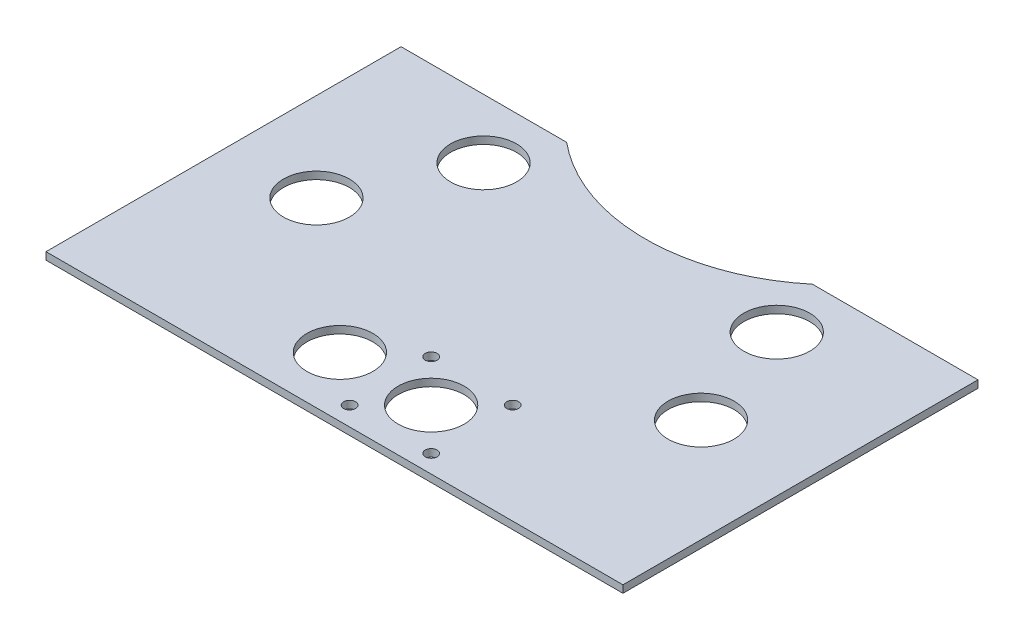
ISO-10303-21;
HEADER;
FILE_DESCRIPTION(('STEP AP214'),'2;1');
FILE_NAME('part.step','',(''),(''),'','','');
FILE_SCHEMA(('AUTOMOTIVE_DESIGN { 1 0 10303 214 1 1 1 1 }'));
ENDSEC;
DATA;
#1=APPLICATION_CONTEXT('core data for automotive mechanical design processes');
#2=APPLICATION_PROTOCOL_DEFINITION('international standard','automotive_design',2000,#1);
#3=PRODUCT_CONTEXT('',#1,'mechanical');
#4=PRODUCT('Part','Part','',(#3));
#5=PRODUCT_RELATED_PRODUCT_CATEGORY('part','',(#4));
#6=PRODUCT_DEFINITION_FORMATION('','',#4);
#7=PRODUCT_DEFINITION_CONTEXT('part definition',#1,'design');
#8=PRODUCT_DEFINITION('design','',#6,#7);
#9=PRODUCT_DEFINITION_SHAPE('','',#8);
#10=(LENGTH_UNIT() NAMED_UNIT(*) SI_UNIT(.MILLI.,.METRE.));
#11=(NAMED_UNIT(*) PLANE_ANGLE_UNIT() SI_UNIT($,.RADIAN.));
#12=(NAMED_UNIT(*) SI_UNIT($,.STERADIAN.) SOLID_ANGLE_UNIT());
#13=UNCERTAINTY_MEASURE_WITH_UNIT(LENGTH_MEASURE(1.E-05),#10,'distance_accuracy_value','');
#14=(GEOMETRIC_REPRESENTATION_CONTEXT(3) GLOBAL_UNCERTAINTY_ASSIGNED_CONTEXT((#13)) GLOBAL_UNIT_ASSIGNED_CONTEXT((#10,
#11,#12)) REPRESENTATION_CONTEXT('',''));
#15=CARTESIAN_POINT('',(0.,0.,0.));
#16=DIRECTION('',(0.,0.,1.));
#17=DIRECTION('',(1.,0.,0.));
#18=AXIS2_PLACEMENT_3D('',#15,#16,#17);
#19=CARTESIAN_POINT('',(-123.825,3.175,-96.52));
#20=DIRECTION('',(0.,0.,-1.));
#21=DIRECTION('',(-1.,0.,0.));
#22=AXIS2_PLACEMENT_3D('',#19,#20,#21);
#23=PLANE('',#22);
#24=DIRECTION('',(1.,0.,0.));
#25=VECTOR('',#24,1.);
#26=CARTESIAN_POINT('',(-123.825,0.,-96.52));
#27=LINE('',#26,#25);
#28=CARTESIAN_POINT('',(-123.825,0.,-96.52));
#29=VERTEX_POINT('',#28);
#30=CARTESIAN_POINT('',(-52.7470615295299,0.,-96.52));
#31=VERTEX_POINT('',#30);
#32=EDGE_CURVE('E129',#29,#31,#27,.T.);
#33=ORIENTED_EDGE('',*,*,#32,.F.);
#34=DIRECTION('',(0.,-1.,0.));
#35=VECTOR('',#34,1.);
#36=CARTESIAN_POINT('',(-123.825,3.175,-96.52));
#37=LINE('',#36,#35);
#38=CARTESIAN_POINT('',(-123.825,3.175,-96.52));
#39=VERTEX_POINT('',#38);
#40=EDGE_CURVE('E11',#39,#29,#37,.T.);
#41=ORIENTED_EDGE('',*,*,#40,.F.);
#42=DIRECTION('',(1.,0.,0.));
#43=VECTOR('',#42,1.);
#44=CARTESIAN_POINT('',(-123.825,3.175,-96.52));
#45=LINE('',#44,#43);
#46=CARTESIAN_POINT('',(-52.7470615295299,3.175,-96.52));
#47=VERTEX_POINT('',#46);
#48=EDGE_CURVE('E150',#39,#47,#45,.T.);
#49=ORIENTED_EDGE('',*,*,#48,.T.);
#50=DIRECTION('',(0.,-1.,0.));
#51=VECTOR('',#50,1.);
#52=CARTESIAN_POINT('',(-52.7470615295299,3.175,-96.52));
#53=LINE('',#52,#51);
#54=EDGE_CURVE('E88',#47,#31,#53,.T.);
#55=ORIENTED_EDGE('',*,*,#54,.T.);
#56=EDGE_LOOP('',(#33,#41,#49,#55));
#57=FACE_BOUND('',#56,.T.);
#58=ADVANCED_FACE('F38',(#57),#23,.T.);
#59=CARTESIAN_POINT('',(-123.825,3.175,55.88));
#60=DIRECTION('',(-1.,0.,0.));
#61=DIRECTION('',(0.,0.,1.));
#62=AXIS2_PLACEMENT_3D('',#59,#60,#61);
#63=PLANE('',#62);
#64=DIRECTION('',(0.,0.,-1.));
#65=VECTOR('',#64,1.);
#66=CARTESIAN_POINT('',(-123.825,0.,55.88));
#67=LINE('',#66,#65);
#68=CARTESIAN_POINT('',(-123.825,0.,55.88));
#69=VERTEX_POINT('',#68);
#70=EDGE_CURVE('E147',#69,#29,#67,.T.);
#71=ORIENTED_EDGE('',*,*,#70,.F.);
#72=DIRECTION('',(0.,-1.,0.));
#73=VECTOR('',#72,1.);
#74=CARTESIAN_POINT('',(-123.825,3.175,55.88));
#75=LINE('',#74,#73);
#76=CARTESIAN_POINT('',(-123.825,3.175,55.88));
#77=VERTEX_POINT('',#76);
#78=EDGE_CURVE('E48',#77,#69,#75,.T.);
#79=ORIENTED_EDGE('',*,*,#78,.F.);
#80=DIRECTION('',(0.,0.,-1.));
#81=VECTOR('',#80,1.);
#82=CARTESIAN_POINT('',(-123.825,3.175,55.88));
#83=LINE('',#82,#81);
#84=EDGE_CURVE('E104',#77,#39,#83,.T.);
#85=ORIENTED_EDGE('',*,*,#84,.T.);
#86=ORIENTED_EDGE('',*,*,#40,.T.);
#87=EDGE_LOOP('',(#71,#79,#85,#86));
#88=FACE_BOUND('',#87,.T.);
#89=ADVANCED_FACE('F164',(#88),#63,.T.);
#90=CARTESIAN_POINT('',(-123.825,3.175,55.88));
#91=DIRECTION('',(0.,0.,-1.));
#92=DIRECTION('',(-1.,0.,0.));
#93=AXIS2_PLACEMENT_3D('',#90,#91,#92);
#94=PLANE('',#93);
#95=DIRECTION('',(1.,0.,0.));
#96=VECTOR('',#95,1.);
#97=CARTESIAN_POINT('',(-123.825,0.,55.88));
#98=LINE('',#97,#96);
#99=CARTESIAN_POINT('',(123.825,0.,55.88));
#100=VERTEX_POINT('',#99);
#101=EDGE_CURVE('E110',#69,#100,#98,.T.);
#102=ORIENTED_EDGE('',*,*,#101,.T.);
#103=DIRECTION('',(0.,-1.,0.));
#104=VECTOR('',#103,1.);
#105=CARTESIAN_POINT('',(123.825,3.175,55.88));
#106=LINE('',#105,#104);
#107=CARTESIAN_POINT('',(123.825,3.175,55.88));
#108=VERTEX_POINT('',#107);
#109=EDGE_CURVE('E108',#108,#100,#106,.T.);
#110=ORIENTED_EDGE('',*,*,#109,.F.);
#111=DIRECTION('',(1.,0.,0.));
#112=VECTOR('',#111,1.);
#113=CARTESIAN_POINT('',(-123.825,3.175,55.88));
#114=LINE('',#113,#112);
#115=EDGE_CURVE('E98',#77,#108,#114,.T.);
#116=ORIENTED_EDGE('',*,*,#115,.F.);
#117=ORIENTED_EDGE('',*,*,#78,.T.);
#118=EDGE_LOOP('',(#102,#110,#116,#117));
#119=FACE_BOUND('',#118,.T.);
#120=ADVANCED_FACE('F109',(#119),#94,.F.);
#121=CARTESIAN_POINT('',(123.825,3.175,55.88));
#122=DIRECTION('',(-1.,0.,0.));
#123=DIRECTION('',(0.,0.,1.));
#124=AXIS2_PLACEMENT_3D('',#121,#122,#123);
#125=PLANE('',#124);
#126=DIRECTION('',(0.,0.,-1.));
#127=VECTOR('',#126,1.);
#128=CARTESIAN_POINT('',(123.825,0.,55.88));
#129=LINE('',#128,#127);
#130=CARTESIAN_POINT('',(123.825,0.,-96.52));
#131=VERTEX_POINT('',#130);
#132=EDGE_CURVE('E142',#100,#131,#129,.T.);
#133=ORIENTED_EDGE('',*,*,#132,.T.);
#134=DIRECTION('',(0.,-1.,0.));
#135=VECTOR('',#134,1.);
#136=CARTESIAN_POINT('',(123.825,3.175,-96.52));
#137=LINE('',#136,#135);
#138=CARTESIAN_POINT('',(123.825,3.175,-96.52));
#139=VERTEX_POINT('',#138);
#140=EDGE_CURVE('E114',#139,#131,#137,.T.);
#141=ORIENTED_EDGE('',*,*,#140,.F.);
#142=DIRECTION('',(0.,0.,-1.));
#143=VECTOR('',#142,1.);
#144=CARTESIAN_POINT('',(123.825,3.175,55.88));
#145=LINE('',#144,#143);
#146=EDGE_CURVE('E102',#108,#139,#145,.T.);
#147=ORIENTED_EDGE('',*,*,#146,.F.);
#148=ORIENTED_EDGE('',*,*,#109,.T.);
#149=EDGE_LOOP('',(#133,#141,#147,#148));
#150=FACE_BOUND('',#149,.T.);
#151=ADVANCED_FACE('F116',(#150),#125,.F.);
#152=CARTESIAN_POINT('',(123.825,3.175,-96.52));
#153=DIRECTION('',(0.,0.,1.));
#154=DIRECTION('',(1.,0.,0.));
#155=AXIS2_PLACEMENT_3D('',#152,#153,#154);
#156=PLANE('',#155);
#157=DIRECTION('',(-1.,0.,0.));
#158=VECTOR('',#157,1.);
#159=CARTESIAN_POINT('',(123.825,0.,-96.52));
#160=LINE('',#159,#158);
#161=CARTESIAN_POINT('',(52.7470615295298,0.,-96.52));
#162=VERTEX_POINT('',#161);
#163=EDGE_CURVE('E138',#131,#162,#160,.T.);
#164=ORIENTED_EDGE('',*,*,#163,.T.);
#165=DIRECTION('',(0.,-1.,0.));
#166=VECTOR('',#165,1.);
#167=CARTESIAN_POINT('',(52.7470615295298,3.175,-96.52));
#168=LINE('',#167,#166);
#169=CARTESIAN_POINT('',(52.7470615295298,3.175,-96.52));
#170=VERTEX_POINT('',#169);
#171=EDGE_CURVE('E156',#170,#162,#168,.T.);
#172=ORIENTED_EDGE('',*,*,#171,.F.);
#173=DIRECTION('',(-1.,0.,0.));
#174=VECTOR('',#173,1.);
#175=CARTESIAN_POINT('',(123.825,3.175,-96.52));
#176=LINE('',#175,#174);
#177=EDGE_CURVE('E120',#139,#170,#176,.T.);
#178=ORIENTED_EDGE('',*,*,#177,.F.);
#179=ORIENTED_EDGE('',*,*,#140,.T.);
#180=EDGE_LOOP('',(#164,#172,#178,#179));
#181=FACE_BOUND('',#180,.T.);
#182=ADVANCED_FACE('F177',(#181),#156,.F.);
#183=CARTESIAN_POINT('',(0.,3.175,-160.02));
#184=DIRECTION('',(0.,-1.,0.));
#185=DIRECTION('',(0.,0.,-1.));
#186=AXIS2_PLACEMENT_3D('',#183,#184,#185);
#187=CYLINDRICAL_SURFACE('',#186,82.55);
#188=CARTESIAN_POINT('',(0.,0.,-160.02));
#189=DIRECTION('',(0.,1.,0.));
#190=DIRECTION('',(0.,0.,1.));
#191=AXIS2_PLACEMENT_3D('',#188,#189,#190);
#192=CIRCLE('',#191,82.55);
#193=EDGE_CURVE('E133',#31,#162,#192,.T.);
#194=ORIENTED_EDGE('',*,*,#193,.F.);
#195=ORIENTED_EDGE('',*,*,#54,.F.);
#196=CARTESIAN_POINT('',(0.,3.175,-160.02));
#197=DIRECTION('',(0.,1.,0.));
#198=DIRECTION('',(0.,0.,1.));
#199=AXIS2_PLACEMENT_3D('',#196,#197,#198);
#200=CIRCLE('',#199,82.55);
#201=EDGE_CURVE('E123',#47,#170,#200,.T.);
#202=ORIENTED_EDGE('',*,*,#201,.T.);
#203=ORIENTED_EDGE('',*,*,#171,.T.);
#204=EDGE_LOOP('',(#194,#195,#202,#203));
#205=FACE_BOUND('',#204,.T.);
#206=ADVANCED_FACE('F159',(#205),#187,.F.);
#207=CARTESIAN_POINT('',(0.,3.175,-160.02));
#208=DIRECTION('',(0.,1.,0.));
#209=DIRECTION('',(0.,0.,1.));
#210=AXIS2_PLACEMENT_3D('',#207,#208,#209);
#211=PLANE('',#210);
#212=CARTESIAN_POINT('',(62.9334955393349,3.175,-71.0350243309003));
#213=DIRECTION('',(0.,-1.,0.));
#214=DIRECTION('',(0.,0.,1.));
#215=AXIS2_PLACEMENT_3D('',#212,#213,#214);
#216=CIRCLE('',#215,14.1605);
#217=CARTESIAN_POINT('',(62.9334955393349,3.175,-56.8745243309003));
#218=VERTEX_POINT('',#217);
#219=EDGE_CURVE('E238',#218,#218,#216,.T.);
#220=ORIENTED_EDGE('',*,*,#219,.T.);
#221=EDGE_LOOP('',(#220));
#222=FACE_BOUND('',#221,.T.);
#223=CARTESIAN_POINT('',(-62.9334955393349,3.175,-71.0350243309003));
#224=DIRECTION('',(0.,1.,0.));
#225=DIRECTION('',(0.,0.,1.));
#226=AXIS2_PLACEMENT_3D('',#223,#224,#225);
#227=CIRCLE('',#226,14.1605);
#228=CARTESIAN_POINT('',(-62.9334955393349,3.175,-56.8745243309003));
#229=VERTEX_POINT('',#228);
#230=EDGE_CURVE('E242',#229,#229,#227,.T.);
#231=ORIENTED_EDGE('',*,*,#230,.F.);
#232=EDGE_LOOP('',(#231));
#233=FACE_BOUND('',#232,.T.);
#234=CARTESIAN_POINT('',(-23.3045,3.175,30.2569424475206));
#235=DIRECTION('',(0.,1.,0.));
#236=DIRECTION('',(0.,0.,1.));
#237=AXIS2_PLACEMENT_3D('',#234,#235,#236);
#238=CIRCLE('',#237,14.1605);
#239=CARTESIAN_POINT('',(-23.3045,3.175,44.4174424475206));
#240=VERTEX_POINT('',#239);
#241=EDGE_CURVE('E249',#240,#240,#238,.T.);
#242=ORIENTED_EDGE('',*,*,#241,.F.);
#243=EDGE_LOOP('',(#242));
#244=FACE_BOUND('',#243,.T.);
#245=CARTESIAN_POINT('',(-85.725,3.175,-22.098));
#246=DIRECTION('',(0.,-1.,0.));
#247=DIRECTION('',(0.,0.,-1.));
#248=AXIS2_PLACEMENT_3D('',#245,#246,#247);
#249=CIRCLE('',#248,14.1605);
#250=CARTESIAN_POINT('',(-85.725,3.175,-36.2585));
#251=VERTEX_POINT('',#250);
#252=EDGE_CURVE('E257',#251,#251,#249,.T.);
#253=ORIENTED_EDGE('',*,*,#252,.T.);
#254=EDGE_LOOP('',(#253));
#255=FACE_BOUND('',#254,.T.);
#256=CARTESIAN_POINT('',(79.375,3.175,-22.098));
#257=DIRECTION('',(0.,-1.,0.));
#258=DIRECTION('',(0.,0.,-1.));
#259=AXIS2_PLACEMENT_3D('',#256,#257,#258);
#260=CIRCLE('',#259,14.1605);
#261=CARTESIAN_POINT('',(79.375,3.175,-36.2585));
#262=VERTEX_POINT('',#261);
#263=EDGE_CURVE('E264',#262,#262,#260,.T.);
#264=ORIENTED_EDGE('',*,*,#263,.T.);
#265=EDGE_LOOP('',(#264));
#266=FACE_BOUND('',#265,.T.);
#267=CARTESIAN_POINT('',(-1.62500000000002,3.175,47.7569424475206));
#268=DIRECTION('',(0.,1.,0.));
#269=DIRECTION('',(0.,0.,1.));
#270=AXIS2_PLACEMENT_3D('',#267,#268,#269);
#271=CIRCLE('',#270,2.5527);
#272=CARTESIAN_POINT('',(-1.62500000000002,3.175,50.3096424475206));
#273=VERTEX_POINT('',#272);
#274=EDGE_CURVE('E272',#273,#273,#271,.T.);
#275=ORIENTED_EDGE('',*,*,#274,.F.);
#276=EDGE_LOOP('',(#275));
#277=FACE_BOUND('',#276,.T.);
#278=CARTESIAN_POINT('',(33.375,3.175,12.7569424475206));
#279=DIRECTION('',(0.,1.,0.));
#280=DIRECTION('',(0.,0.,1.));
#281=AXIS2_PLACEMENT_3D('',#278,#279,#280);
#282=CIRCLE('',#281,2.5527);
#283=CARTESIAN_POINT('',(33.375,3.175,15.3096424475206));
#284=VERTEX_POINT('',#283);
#285=EDGE_CURVE('E280',#284,#284,#282,.T.);
#286=ORIENTED_EDGE('',*,*,#285,.F.);
#287=EDGE_LOOP('',(#286));
#288=FACE_BOUND('',#287,.T.);
#289=CARTESIAN_POINT('',(-2.08551224213836,3.175,12.2964302053823));
#290=DIRECTION('',(0.,1.,0.));
#291=DIRECTION('',(0.,0.,1.));
#292=AXIS2_PLACEMENT_3D('',#289,#290,#291);
#293=CIRCLE('',#292,2.5527);
#294=CARTESIAN_POINT('',(-2.08551224213836,3.175,14.8491302053823));
#295=VERTEX_POINT('',#294);
#296=EDGE_CURVE('E288',#295,#295,#293,.T.);
#297=ORIENTED_EDGE('',*,*,#296,.F.);
#298=EDGE_LOOP('',(#297));
#299=FACE_BOUND('',#298,.T.);
#300=CARTESIAN_POINT('',(33.8355122421383,3.175,48.2174546896589));
#301=DIRECTION('',(0.,1.,0.));
#302=DIRECTION('',(0.,0.,1.));
#303=AXIS2_PLACEMENT_3D('',#300,#301,#302);
#304=CIRCLE('',#303,2.5527);
#305=CARTESIAN_POINT('',(33.8355122421383,3.175,50.7701546896589));
#306=VERTEX_POINT('',#305);
#307=EDGE_CURVE('E296',#306,#306,#304,.T.);
#308=ORIENTED_EDGE('',*,*,#307,.F.);
#309=EDGE_LOOP('',(#308));
#310=FACE_BOUND('',#309,.T.);
#311=CARTESIAN_POINT('',(15.875,3.175,30.2569424475206));
#312=DIRECTION('',(0.,1.,0.));
#313=DIRECTION('',(0.,0.,1.));
#314=AXIS2_PLACEMENT_3D('',#311,#312,#313);
#315=CIRCLE('',#314,14.1605);
#316=CARTESIAN_POINT('',(15.875,3.175,44.4174424475206));
#317=VERTEX_POINT('',#316);
#318=EDGE_CURVE('E304',#317,#317,#315,.T.);
#319=ORIENTED_EDGE('',*,*,#318,.F.);
#320=EDGE_LOOP('',(#319));
#321=FACE_BOUND('',#320,.T.);
#322=ORIENTED_EDGE('',*,*,#48,.F.);
#323=ORIENTED_EDGE('',*,*,#84,.F.);
#324=ORIENTED_EDGE('',*,*,#115,.T.);
#325=ORIENTED_EDGE('',*,*,#146,.T.);
#326=ORIENTED_EDGE('',*,*,#177,.T.);
#327=ORIENTED_EDGE('',*,*,#201,.F.);
#328=EDGE_LOOP('',(#322,#323,#324,#325,#326,#327));
#329=FACE_BOUND('',#328,.T.);
#330=ADVANCED_FACE('F100',(#222,#233,#244,#255,#266,#277,#288,#299,#310,#321,#329),#211,.T.);
#331=CARTESIAN_POINT('',(0.,0.,-160.02));
#332=DIRECTION('',(0.,1.,0.));
#333=DIRECTION('',(0.,0.,1.));
#334=AXIS2_PLACEMENT_3D('',#331,#332,#333);
#335=PLANE('',#334);
#336=CARTESIAN_POINT('',(62.9334955393349,0.,-71.0350243309003));
#337=DIRECTION('',(0.,-1.,0.));
#338=DIRECTION('',(0.,0.,1.));
#339=AXIS2_PLACEMENT_3D('',#336,#337,#338);
#340=CIRCLE('',#339,14.1605);
#341=CARTESIAN_POINT('',(62.9334955393349,0.,-56.8745243309003));
#342=VERTEX_POINT('',#341);
#343=EDGE_CURVE('E236',#342,#342,#340,.T.);
#344=ORIENTED_EDGE('',*,*,#343,.F.);
#345=EDGE_LOOP('',(#344));
#346=FACE_BOUND('',#345,.T.);
#347=CARTESIAN_POINT('',(-62.9334955393349,0.,-71.0350243309003));
#348=DIRECTION('',(0.,1.,0.));
#349=DIRECTION('',(0.,0.,1.));
#350=AXIS2_PLACEMENT_3D('',#347,#348,#349);
#351=CIRCLE('',#350,14.1605);
#352=CARTESIAN_POINT('',(-62.9334955393349,0.,-56.8745243309003));
#353=VERTEX_POINT('',#352);
#354=EDGE_CURVE('E245',#353,#353,#351,.T.);
#355=ORIENTED_EDGE('',*,*,#354,.T.);
#356=EDGE_LOOP('',(#355));
#357=FACE_BOUND('',#356,.T.);
#358=CARTESIAN_POINT('',(-23.3045,0.,30.2569424475206));
#359=DIRECTION('',(0.,1.,0.));
#360=DIRECTION('',(0.,0.,1.));
#361=AXIS2_PLACEMENT_3D('',#358,#359,#360);
#362=CIRCLE('',#361,14.1605);
#363=CARTESIAN_POINT('',(-23.3045,0.,44.4174424475206));
#364=VERTEX_POINT('',#363);
#365=EDGE_CURVE('E253',#364,#364,#362,.T.);
#366=ORIENTED_EDGE('',*,*,#365,.T.);
#367=EDGE_LOOP('',(#366));
#368=FACE_BOUND('',#367,.T.);
#369=CARTESIAN_POINT('',(-85.725,0.,-22.098));
#370=DIRECTION('',(0.,1.,0.));
#371=DIRECTION('',(0.,0.,1.));
#372=AXIS2_PLACEMENT_3D('',#369,#370,#371);
#373=CIRCLE('',#372,14.1605);
#374=CARTESIAN_POINT('',(-85.725,0.,-7.93749999999999));
#375=VERTEX_POINT('',#374);
#376=EDGE_CURVE('E41',#375,#375,#373,.T.);
#377=ORIENTED_EDGE('',*,*,#376,.T.);
#378=EDGE_LOOP('',(#377));
#379=FACE_BOUND('',#378,.T.);
#380=CARTESIAN_POINT('',(79.375,0.,-22.098));
#381=DIRECTION('',(0.,1.,0.));
#382=DIRECTION('',(0.,0.,1.));
#383=AXIS2_PLACEMENT_3D('',#380,#381,#382);
#384=CIRCLE('',#383,14.1605);
#385=CARTESIAN_POINT('',(79.375,0.,-7.93749999999999));
#386=VERTEX_POINT('',#385);
#387=EDGE_CURVE('E268',#386,#386,#384,.T.);
#388=ORIENTED_EDGE('',*,*,#387,.T.);
#389=EDGE_LOOP('',(#388));
#390=FACE_BOUND('',#389,.T.);
#391=CARTESIAN_POINT('',(-1.62500000000002,0.,47.7569424475206));
#392=DIRECTION('',(0.,1.,0.));
#393=DIRECTION('',(0.,0.,1.));
#394=AXIS2_PLACEMENT_3D('',#391,#392,#393);
#395=CIRCLE('',#394,2.5527);
#396=CARTESIAN_POINT('',(-1.62500000000002,0.,50.3096424475206));
#397=VERTEX_POINT('',#396);
#398=EDGE_CURVE('E276',#397,#397,#395,.T.);
#399=ORIENTED_EDGE('',*,*,#398,.T.);
#400=EDGE_LOOP('',(#399));
#401=FACE_BOUND('',#400,.T.);
#402=CARTESIAN_POINT('',(33.375,0.,12.7569424475206));
#403=DIRECTION('',(0.,1.,0.));
#404=DIRECTION('',(0.,0.,1.));
#405=AXIS2_PLACEMENT_3D('',#402,#403,#404);
#406=CIRCLE('',#405,2.5527);
#407=CARTESIAN_POINT('',(33.375,0.,15.3096424475206));
#408=VERTEX_POINT('',#407);
#409=EDGE_CURVE('E284',#408,#408,#406,.T.);
#410=ORIENTED_EDGE('',*,*,#409,.T.);
#411=EDGE_LOOP('',(#410));
#412=FACE_BOUND('',#411,.T.);
#413=CARTESIAN_POINT('',(-2.08551224213836,0.,12.2964302053823));
#414=DIRECTION('',(0.,1.,0.));
#415=DIRECTION('',(0.,0.,1.));
#416=AXIS2_PLACEMENT_3D('',#413,#414,#415);
#417=CIRCLE('',#416,2.5527);
#418=CARTESIAN_POINT('',(-2.08551224213836,0.,14.8491302053823));
#419=VERTEX_POINT('',#418);
#420=EDGE_CURVE('E292',#419,#419,#417,.T.);
#421=ORIENTED_EDGE('',*,*,#420,.T.);
#422=EDGE_LOOP('',(#421));
#423=FACE_BOUND('',#422,.T.);
#424=CARTESIAN_POINT('',(33.8355122421383,0.,48.2174546896589));
#425=DIRECTION('',(0.,1.,0.));
#426=DIRECTION('',(0.,0.,1.));
#427=AXIS2_PLACEMENT_3D('',#424,#425,#426);
#428=CIRCLE('',#427,2.5527);
#429=CARTESIAN_POINT('',(33.8355122421383,0.,50.7701546896589));
#430=VERTEX_POINT('',#429);
#431=EDGE_CURVE('E300',#430,#430,#428,.T.);
#432=ORIENTED_EDGE('',*,*,#431,.T.);
#433=EDGE_LOOP('',(#432));
#434=FACE_BOUND('',#433,.T.);
#435=CARTESIAN_POINT('',(15.875,0.,30.2569424475206));
#436=DIRECTION('',(0.,1.,0.));
#437=DIRECTION('',(0.,0.,1.));
#438=AXIS2_PLACEMENT_3D('',#435,#436,#437);
#439=CIRCLE('',#438,14.1605);
#440=CARTESIAN_POINT('',(15.875,0.,44.4174424475206));
#441=VERTEX_POINT('',#440);
#442=EDGE_CURVE('E134',#441,#441,#439,.T.);
#443=ORIENTED_EDGE('',*,*,#442,.T.);
#444=EDGE_LOOP('',(#443));
#445=FACE_BOUND('',#444,.T.);
#446=ORIENTED_EDGE('',*,*,#32,.T.);
#447=ORIENTED_EDGE('',*,*,#193,.T.);
#448=ORIENTED_EDGE('',*,*,#163,.F.);
#449=ORIENTED_EDGE('',*,*,#132,.F.);
#450=ORIENTED_EDGE('',*,*,#101,.F.);
#451=ORIENTED_EDGE('',*,*,#70,.T.);
#452=EDGE_LOOP('',(#446,#447,#448,#449,#450,#451));
#453=FACE_BOUND('',#452,.T.);
#454=ADVANCED_FACE('F163',(#346,#357,#368,#379,#390,#401,#412,#423,#434,#445,#453),#335,.F.);
#455=CARTESIAN_POINT('',(15.875,3.175,30.2569424475206));
#456=DIRECTION('',(0.,1.,0.));
#457=DIRECTION('',(0.,0.,1.));
#458=AXIS2_PLACEMENT_3D('',#455,#456,#457);
#459=CYLINDRICAL_SURFACE('',#458,14.1605);
#460=ORIENTED_EDGE('',*,*,#442,.F.);
#461=EDGE_LOOP('',(#460));
#462=FACE_BOUND('',#461,.T.);
#463=ORIENTED_EDGE('',*,*,#318,.T.);
#464=EDGE_LOOP('',(#463));
#465=FACE_BOUND('',#464,.T.);
#466=ADVANCED_FACE('F188',(#462,#465),#459,.F.);
#467=CARTESIAN_POINT('',(33.8355122421383,3.175,48.2174546896589));
#468=DIRECTION('',(0.,1.,0.));
#469=DIRECTION('',(0.,0.,1.));
#470=AXIS2_PLACEMENT_3D('',#467,#468,#469);
#471=CYLINDRICAL_SURFACE('',#470,2.5527);
#472=ORIENTED_EDGE('',*,*,#431,.F.);
#473=EDGE_LOOP('',(#472));
#474=FACE_BOUND('',#473,.T.);
#475=ORIENTED_EDGE('',*,*,#307,.T.);
#476=EDGE_LOOP('',(#475));
#477=FACE_BOUND('',#476,.T.);
#478=ADVANCED_FACE('F195',(#474,#477),#471,.F.);
#479=CARTESIAN_POINT('',(-2.08551224213836,3.175,12.2964302053823));
#480=DIRECTION('',(0.,1.,0.));
#481=DIRECTION('',(0.,0.,1.));
#482=AXIS2_PLACEMENT_3D('',#479,#480,#481);
#483=CYLINDRICAL_SURFACE('',#482,2.5527);
#484=ORIENTED_EDGE('',*,*,#420,.F.);
#485=EDGE_LOOP('',(#484));
#486=FACE_BOUND('',#485,.T.);
#487=ORIENTED_EDGE('',*,*,#296,.T.);
#488=EDGE_LOOP('',(#487));
#489=FACE_BOUND('',#488,.T.);
#490=ADVANCED_FACE('F199',(#486,#489),#483,.F.);
#491=CARTESIAN_POINT('',(33.375,3.175,12.7569424475206));
#492=DIRECTION('',(0.,1.,0.));
#493=DIRECTION('',(0.,0.,1.));
#494=AXIS2_PLACEMENT_3D('',#491,#492,#493);
#495=CYLINDRICAL_SURFACE('',#494,2.5527);
#496=ORIENTED_EDGE('',*,*,#409,.F.);
#497=EDGE_LOOP('',(#496));
#498=FACE_BOUND('',#497,.T.);
#499=ORIENTED_EDGE('',*,*,#285,.T.);
#500=EDGE_LOOP('',(#499));
#501=FACE_BOUND('',#500,.T.);
#502=ADVANCED_FACE('F203',(#498,#501),#495,.F.);
#503=CARTESIAN_POINT('',(-1.62500000000002,3.175,47.7569424475206));
#504=DIRECTION('',(0.,1.,0.));
#505=DIRECTION('',(0.,0.,1.));
#506=AXIS2_PLACEMENT_3D('',#503,#504,#505);
#507=CYLINDRICAL_SURFACE('',#506,2.5527);
#508=ORIENTED_EDGE('',*,*,#398,.F.);
#509=EDGE_LOOP('',(#508));
#510=FACE_BOUND('',#509,.T.);
#511=ORIENTED_EDGE('',*,*,#274,.T.);
#512=EDGE_LOOP('',(#511));
#513=FACE_BOUND('',#512,.T.);
#514=ADVANCED_FACE('F207',(#510,#513),#507,.F.);
#515=CARTESIAN_POINT('',(79.375,-34.925,-22.098));
#516=DIRECTION('',(0.,-1.,0.));
#517=DIRECTION('',(0.,0.,-1.));
#518=AXIS2_PLACEMENT_3D('',#515,#516,#517);
#519=CYLINDRICAL_SURFACE('',#518,14.1605);
#520=ORIENTED_EDGE('',*,*,#263,.F.);
#521=EDGE_LOOP('',(#520));
#522=FACE_BOUND('',#521,.T.);
#523=ORIENTED_EDGE('',*,*,#387,.F.);
#524=EDGE_LOOP('',(#523));
#525=FACE_BOUND('',#524,.T.);
#526=ADVANCED_FACE('F211',(#522,#525),#519,.F.);
#527=CARTESIAN_POINT('',(-85.725,-34.925,-22.098));
#528=DIRECTION('',(0.,-1.,0.));
#529=DIRECTION('',(0.,0.,-1.));
#530=AXIS2_PLACEMENT_3D('',#527,#528,#529);
#531=CYLINDRICAL_SURFACE('',#530,14.1605);
#532=ORIENTED_EDGE('',*,*,#252,.F.);
#533=EDGE_LOOP('',(#532));
#534=FACE_BOUND('',#533,.T.);
#535=ORIENTED_EDGE('',*,*,#376,.F.);
#536=EDGE_LOOP('',(#535));
#537=FACE_BOUND('',#536,.T.);
#538=ADVANCED_FACE('F215',(#534,#537),#531,.F.);
#539=CARTESIAN_POINT('',(-23.3045,0.,30.2569424475206));
#540=DIRECTION('',(0.,1.,0.));
#541=DIRECTION('',(0.,0.,1.));
#542=AXIS2_PLACEMENT_3D('',#539,#540,#541);
#543=CYLINDRICAL_SURFACE('',#542,14.1605);
#544=ORIENTED_EDGE('',*,*,#365,.F.);
#545=EDGE_LOOP('',(#544));
#546=FACE_BOUND('',#545,.T.);
#547=ORIENTED_EDGE('',*,*,#241,.T.);
#548=EDGE_LOOP('',(#547));
#549=FACE_BOUND('',#548,.T.);
#550=ADVANCED_FACE('F219',(#546,#549),#543,.F.);
#551=CARTESIAN_POINT('',(-62.9334955393349,0.,-71.0350243309003));
#552=DIRECTION('',(0.,1.,0.));
#553=DIRECTION('',(0.,0.,1.));
#554=AXIS2_PLACEMENT_3D('',#551,#552,#553);
#555=CYLINDRICAL_SURFACE('',#554,14.1605);
#556=ORIENTED_EDGE('',*,*,#354,.F.);
#557=EDGE_LOOP('',(#556));
#558=FACE_BOUND('',#557,.T.);
#559=ORIENTED_EDGE('',*,*,#230,.T.);
#560=EDGE_LOOP('',(#559));
#561=FACE_BOUND('',#560,.T.);
#562=ADVANCED_FACE('F223',(#558,#561),#555,.F.);
#563=CARTESIAN_POINT('',(62.9334955393349,0.,-71.0350243309003));
#564=DIRECTION('',(0.,1.,0.));
#565=DIRECTION('',(0.,0.,1.));
#566=AXIS2_PLACEMENT_3D('',#563,#564,#565);
#567=CYLINDRICAL_SURFACE('',#566,14.1605);
#568=ORIENTED_EDGE('',*,*,#343,.T.);
#569=EDGE_LOOP('',(#568));
#570=FACE_BOUND('',#569,.T.);
#571=ORIENTED_EDGE('',*,*,#219,.F.);
#572=EDGE_LOOP('',(#571));
#573=FACE_BOUND('',#572,.T.);
#574=ADVANCED_FACE('F227',(#570,#573),#567,.F.);
#575=CLOSED_SHELL('',(#58,#89,#120,#151,#182,#206,#330,#454,#466,#478,#490,#502,#514,#526,#538,
#550,#562,#574));
#576=MANIFOLD_SOLID_BREP('B2',#575);
#577=ADVANCED_BREP_SHAPE_REPRESENTATION('',(#18,#576),#14);
#578=SHAPE_DEFINITION_REPRESENTATION(#9,#577);
ENDSEC;
END-ISO-10303-21;
